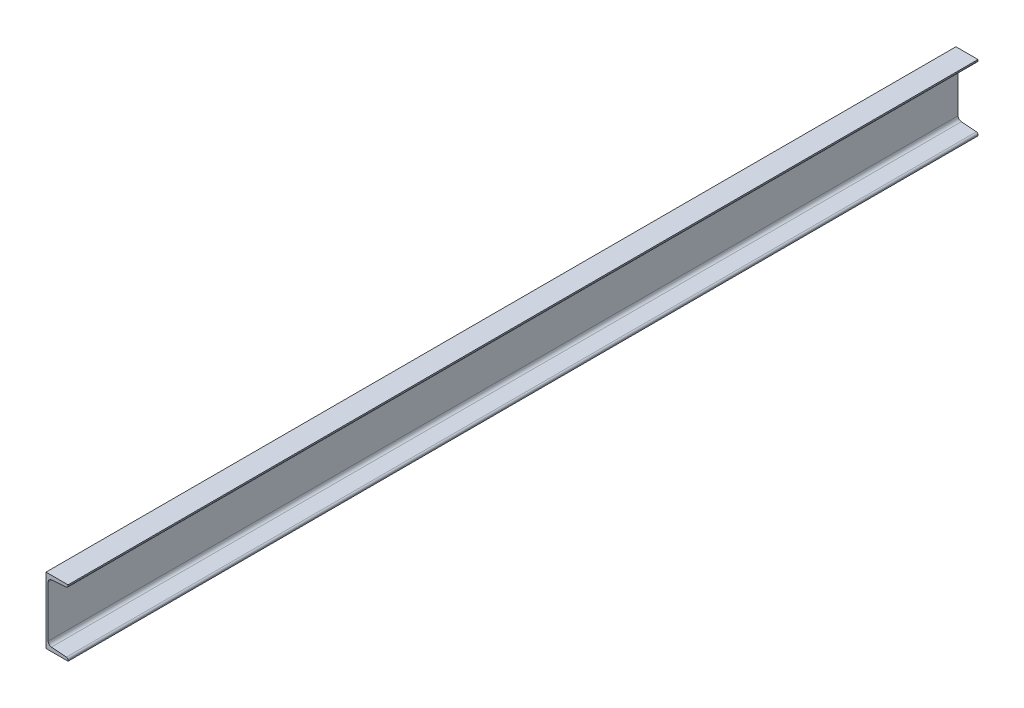
ISO-10303-21;
HEADER;
FILE_DESCRIPTION(('STEP AP214'),'2;1');
FILE_NAME('part.step','',(''),(''),'','','');
FILE_SCHEMA(('AUTOMOTIVE_DESIGN { 1 0 10303 214 1 1 1 1 }'));
ENDSEC;
DATA;
#1=APPLICATION_CONTEXT('core data for automotive mechanical design processes');
#2=APPLICATION_PROTOCOL_DEFINITION('international standard','automotive_design',2000,#1);
#3=PRODUCT_CONTEXT('',#1,'mechanical');
#4=PRODUCT('Part','Part','',(#3));
#5=PRODUCT_RELATED_PRODUCT_CATEGORY('part','',(#4));
#6=PRODUCT_DEFINITION_FORMATION('','',#4);
#7=PRODUCT_DEFINITION_CONTEXT('part definition',#1,'design');
#8=PRODUCT_DEFINITION('design','',#6,#7);
#9=PRODUCT_DEFINITION_SHAPE('','',#8);
#10=(LENGTH_UNIT() NAMED_UNIT(*) SI_UNIT(.MILLI.,.METRE.));
#11=(NAMED_UNIT(*) PLANE_ANGLE_UNIT() SI_UNIT($,.RADIAN.));
#12=(NAMED_UNIT(*) SI_UNIT($,.STERADIAN.) SOLID_ANGLE_UNIT());
#13=UNCERTAINTY_MEASURE_WITH_UNIT(LENGTH_MEASURE(1.E-05),#10,'distance_accuracy_value','');
#14=(GEOMETRIC_REPRESENTATION_CONTEXT(3) GLOBAL_UNCERTAINTY_ASSIGNED_CONTEXT((#13)) GLOBAL_UNIT_ASSIGNED_CONTEXT((#10,
#11,#12)) REPRESENTATION_CONTEXT('',''));
#15=CARTESIAN_POINT('',(0.,0.,0.));
#16=DIRECTION('',(0.,0.,1.));
#17=DIRECTION('',(1.,0.,0.));
#18=AXIS2_PLACEMENT_3D('',#15,#16,#17);
#19=CARTESIAN_POINT('',(5066.58544457096,2971.47976473154,4125.));
#20=DIRECTION('',(0.,1.,0.));
#21=DIRECTION('',(0.,0.,1.));
#22=AXIS2_PLACEMENT_3D('',#19,#20,#21);
#23=PLANE('',#22);
#24=DIRECTION('',(1.,0.,0.));
#25=VECTOR('',#24,1.);
#26=CARTESIAN_POINT('',(5066.58544457096,2971.47976473154,0.));
#27=LINE('',#26,#25);
#28=CARTESIAN_POINT('',(4966.58544457096,2971.47976473154,0.));
#29=VERTEX_POINT('',#28);
#30=CARTESIAN_POINT('',(5066.58544457096,2971.47976473154,0.));
#31=VERTEX_POINT('',#30);
#32=EDGE_CURVE('E164',#29,#31,#27,.T.);
#33=ORIENTED_EDGE('',*,*,#32,.T.);
#34=DIRECTION('',(0.,0.,-1.));
#35=VECTOR('',#34,1.);
#36=CARTESIAN_POINT('',(5066.58544457096,2971.47976473154,4125.));
#37=LINE('',#36,#35);
#38=CARTESIAN_POINT('',(5066.58544457096,2971.47976473154,4125.));
#39=VERTEX_POINT('',#38);
#40=EDGE_CURVE('E11',#39,#31,#37,.T.);
#41=ORIENTED_EDGE('',*,*,#40,.F.);
#42=DIRECTION('',(1.,0.,0.));
#43=VECTOR('',#42,1.);
#44=CARTESIAN_POINT('',(5066.58544457096,2971.47976473154,4125.));
#45=LINE('',#44,#43);
#46=CARTESIAN_POINT('',(4966.58544457096,2971.47976473154,4125.));
#47=VERTEX_POINT('',#46);
#48=EDGE_CURVE('E198',#47,#39,#45,.T.);
#49=ORIENTED_EDGE('',*,*,#48,.F.);
#50=DIRECTION('',(0.,0.,-1.));
#51=VECTOR('',#50,1.);
#52=CARTESIAN_POINT('',(4966.58544457096,2971.47976473154,4125.));
#53=LINE('',#52,#51);
#54=EDGE_CURVE('E160',#47,#29,#53,.T.);
#55=ORIENTED_EDGE('',*,*,#54,.T.);
#56=EDGE_LOOP('',(#33,#41,#49,#55));
#57=FACE_BOUND('',#56,.T.);
#58=ADVANCED_FACE('F39',(#57),#23,.F.);
#59=CARTESIAN_POINT('',(5066.58544457096,2971.47976473154,4125.));
#60=DIRECTION('',(-1.,0.,0.));
#61=DIRECTION('',(0.,0.,1.));
#62=AXIS2_PLACEMENT_3D('',#59,#60,#61);
#63=PLANE('',#62);
#64=DIRECTION('',(0.,1.,0.));
#65=VECTOR('',#64,1.);
#66=CARTESIAN_POINT('',(5066.58544457096,2971.47976473154,0.));
#67=LINE('',#66,#65);
#68=CARTESIAN_POINT('',(5066.58544457096,2976.04549735289,0.));
#69=VERTEX_POINT('',#68);
#70=EDGE_CURVE('E168',#31,#69,#67,.T.);
#71=ORIENTED_EDGE('',*,*,#70,.T.);
#72=DIRECTION('',(0.,0.,-1.));
#73=VECTOR('',#72,1.);
#74=CARTESIAN_POINT('',(5066.58544457096,2976.04549735289,4125.));
#75=LINE('',#74,#73);
#76=CARTESIAN_POINT('',(5066.58544457096,2976.04549735289,4125.));
#77=VERTEX_POINT('',#76);
#78=EDGE_CURVE('E48',#77,#69,#75,.T.);
#79=ORIENTED_EDGE('',*,*,#78,.F.);
#80=DIRECTION('',(0.,1.,0.));
#81=VECTOR('',#80,1.);
#82=CARTESIAN_POINT('',(5066.58544457096,2971.47976473154,4125.));
#83=LINE('',#82,#81);
#84=EDGE_CURVE('E111',#39,#77,#83,.T.);
#85=ORIENTED_EDGE('',*,*,#84,.F.);
#86=ORIENTED_EDGE('',*,*,#40,.T.);
#87=EDGE_LOOP('',(#71,#79,#85,#86));
#88=FACE_BOUND('',#87,.T.);
#89=ADVANCED_FACE('F292',(#88),#63,.F.);
#90=CARTESIAN_POINT('',(5058.58544457096,2976.04549735289,4125.));
#91=DIRECTION('',(0.,0.,-1.));
#92=DIRECTION('',(-1.,0.,0.));
#93=AXIS2_PLACEMENT_3D('',#90,#91,#92);
#94=CYLINDRICAL_SURFACE('',#93,7.99999999999969);
#95=CARTESIAN_POINT('',(5058.58544457096,2976.04549735289,0.));
#96=DIRECTION('',(0.,0.,1.));
#97=DIRECTION('',(1.,0.,0.));
#98=AXIS2_PLACEMENT_3D('',#95,#96,#97);
#99=CIRCLE('',#98,7.99999999999969);
#100=CARTESIAN_POINT('',(5059.23245605057,2984.01929043681,0.));
#101=VERTEX_POINT('',#100);
#102=EDGE_CURVE('E171',#69,#101,#99,.T.);
#103=ORIENTED_EDGE('',*,*,#102,.T.);
#104=DIRECTION('',(0.,0.,-1.));
#105=VECTOR('',#104,1.);
#106=CARTESIAN_POINT('',(5059.23245605057,2984.01929043681,4125.));
#107=LINE('',#106,#105);
#108=CARTESIAN_POINT('',(5059.23245605057,2984.01929043681,4125.));
#109=VERTEX_POINT('',#108);
#110=EDGE_CURVE('E225',#109,#101,#107,.T.);
#111=ORIENTED_EDGE('',*,*,#110,.F.);
#112=CARTESIAN_POINT('',(5058.58544457096,2976.04549735289,4125.));
#113=DIRECTION('',(0.,0.,1.));
#114=DIRECTION('',(1.,0.,0.));
#115=AXIS2_PLACEMENT_3D('',#112,#113,#114);
#116=CIRCLE('',#115,7.99999999999969);
#117=EDGE_CURVE('E235',#77,#109,#116,.T.);
#118=ORIENTED_EDGE('',*,*,#117,.F.);
#119=ORIENTED_EDGE('',*,*,#78,.T.);
#120=EDGE_LOOP('',(#103,#111,#118,#119));
#121=FACE_BOUND('',#120,.T.);
#122=ADVANCED_FACE('F233',(#121),#94,.T.);
#123=CARTESIAN_POINT('',(4991.29142161174,2989.53217856369,4125.));
#124=DIRECTION('',(-0.0808764349513209,-0.996724135490641,0.));
#125=DIRECTION('',(0.996724135490641,-0.0808764349513209,0.));
#126=AXIS2_PLACEMENT_3D('',#123,#124,#125);
#127=PLANE('',#126);
#128=DIRECTION('',(-0.996724135490641,0.0808764349513209,0.));
#129=VECTOR('',#128,1.);
#130=CARTESIAN_POINT('',(4991.29142161174,2989.53217856369,0.));
#131=LINE('',#130,#129);
#132=CARTESIAN_POINT('',(4991.29142161174,2989.53217856369,0.));
#133=VERTEX_POINT('',#132);
#134=EDGE_CURVE('E174',#101,#133,#131,.T.);
#135=ORIENTED_EDGE('',*,*,#134,.T.);
#136=DIRECTION('',(0.,0.,-1.));
#137=VECTOR('',#136,1.);
#138=CARTESIAN_POINT('',(4991.29142161174,2989.53217856369,4125.));
#139=LINE('',#138,#137);
#140=CARTESIAN_POINT('',(4991.29142161174,2989.53217856369,4125.));
#141=VERTEX_POINT('',#140);
#142=EDGE_CURVE('E221',#141,#133,#139,.T.);
#143=ORIENTED_EDGE('',*,*,#142,.F.);
#144=DIRECTION('',(-0.996724135490641,0.0808764349513209,0.));
#145=VECTOR('',#144,1.);
#146=CARTESIAN_POINT('',(4991.29142161174,2989.53217856369,4125.));
#147=LINE('',#146,#145);
#148=EDGE_CURVE('E254',#109,#141,#147,.T.);
#149=ORIENTED_EDGE('',*,*,#148,.F.);
#150=ORIENTED_EDGE('',*,*,#110,.T.);
#151=EDGE_LOOP('',(#135,#143,#149,#150));
#152=FACE_BOUND('',#151,.T.);
#153=ADVANCED_FACE('F244',(#152),#127,.F.);
#154=CARTESIAN_POINT('',(4992.58544457096,3005.47976473154,4125.));
#155=DIRECTION('',(0.,0.,-1.));
#156=DIRECTION('',(-1.,0.,0.));
#157=AXIS2_PLACEMENT_3D('',#154,#155,#156);
#158=CYLINDRICAL_SURFACE('',#157,15.9999999999996);
#159=CARTESIAN_POINT('',(4992.58544457096,3005.47976473154,0.));
#160=DIRECTION('',(0.,0.,-1.));
#161=DIRECTION('',(-1.,0.,0.));
#162=AXIS2_PLACEMENT_3D('',#159,#160,#161);
#163=CIRCLE('',#162,15.9999999999996);
#164=CARTESIAN_POINT('',(4976.58544457096,3005.47976473154,0.));
#165=VERTEX_POINT('',#164);
#166=EDGE_CURVE('E177',#133,#165,#163,.T.);
#167=ORIENTED_EDGE('',*,*,#166,.T.);
#168=DIRECTION('',(0.,0.,-1.));
#169=VECTOR('',#168,1.);
#170=CARTESIAN_POINT('',(4976.58544457096,3005.47976473154,4125.));
#171=LINE('',#170,#169);
#172=CARTESIAN_POINT('',(4976.58544457096,3005.47976473154,4125.));
#173=VERTEX_POINT('',#172);
#174=EDGE_CURVE('E217',#173,#165,#171,.T.);
#175=ORIENTED_EDGE('',*,*,#174,.F.);
#176=CARTESIAN_POINT('',(4992.58544457096,3005.47976473154,4125.));
#177=DIRECTION('',(0.,0.,-1.));
#178=DIRECTION('',(-1.,0.,0.));
#179=AXIS2_PLACEMENT_3D('',#176,#177,#178);
#180=CIRCLE('',#179,15.9999999999996);
#181=EDGE_CURVE('E250',#141,#173,#180,.T.);
#182=ORIENTED_EDGE('',*,*,#181,.F.);
#183=ORIENTED_EDGE('',*,*,#142,.T.);
#184=EDGE_LOOP('',(#167,#175,#182,#183));
#185=FACE_BOUND('',#184,.T.);
#186=ADVANCED_FACE('F248',(#185),#158,.F.);
#187=CARTESIAN_POINT('',(4976.58544457096,3237.47976473154,4125.));
#188=DIRECTION('',(-1.,0.,0.));
#189=DIRECTION('',(0.,0.,1.));
#190=AXIS2_PLACEMENT_3D('',#187,#188,#189);
#191=PLANE('',#190);
#192=DIRECTION('',(0.,1.,0.));
#193=VECTOR('',#192,1.);
#194=CARTESIAN_POINT('',(4976.58544457096,3237.47976473154,0.));
#195=LINE('',#194,#193);
#196=CARTESIAN_POINT('',(4976.58544457096,3237.47976473154,0.));
#197=VERTEX_POINT('',#196);
#198=EDGE_CURVE('E180',#165,#197,#195,.T.);
#199=ORIENTED_EDGE('',*,*,#198,.T.);
#200=DIRECTION('',(0.,0.,-1.));
#201=VECTOR('',#200,1.);
#202=CARTESIAN_POINT('',(4976.58544457096,3237.47976473154,4125.));
#203=LINE('',#202,#201);
#204=CARTESIAN_POINT('',(4976.58544457096,3237.47976473154,4125.));
#205=VERTEX_POINT('',#204);
#206=EDGE_CURVE('E213',#205,#197,#203,.T.);
#207=ORIENTED_EDGE('',*,*,#206,.F.);
#208=DIRECTION('',(0.,1.,0.));
#209=VECTOR('',#208,1.);
#210=CARTESIAN_POINT('',(4976.58544457096,3237.47976473154,4125.));
#211=LINE('',#210,#209);
#212=EDGE_CURVE('E253',#173,#205,#211,.T.);
#213=ORIENTED_EDGE('',*,*,#212,.F.);
#214=ORIENTED_EDGE('',*,*,#174,.T.);
#215=EDGE_LOOP('',(#199,#207,#213,#214));
#216=FACE_BOUND('',#215,.T.);
#217=ADVANCED_FACE('F305',(#216),#191,.F.);
#218=CARTESIAN_POINT('',(4992.58544457096,3237.47976473154,4125.));
#219=DIRECTION('',(0.,0.,-1.));
#220=DIRECTION('',(-1.,0.,0.));
#221=AXIS2_PLACEMENT_3D('',#218,#219,#220);
#222=CYLINDRICAL_SURFACE('',#221,15.9999999999996);
#223=CARTESIAN_POINT('',(4992.58544457096,3237.47976473154,0.));
#224=DIRECTION('',(0.,0.,-1.));
#225=DIRECTION('',(1.,0.,0.));
#226=AXIS2_PLACEMENT_3D('',#223,#224,#225);
#227=CIRCLE('',#226,15.9999999999996);
#228=CARTESIAN_POINT('',(4991.29142161174,3253.42735089939,0.));
#229=VERTEX_POINT('',#228);
#230=EDGE_CURVE('E183',#197,#229,#227,.T.);
#231=ORIENTED_EDGE('',*,*,#230,.T.);
#232=DIRECTION('',(0.,0.,-1.));
#233=VECTOR('',#232,1.);
#234=CARTESIAN_POINT('',(4991.29142161174,3253.42735089939,4125.));
#235=LINE('',#234,#233);
#236=CARTESIAN_POINT('',(4991.29142161174,3253.42735089939,4125.));
#237=VERTEX_POINT('',#236);
#238=EDGE_CURVE('E209',#237,#229,#235,.T.);
#239=ORIENTED_EDGE('',*,*,#238,.F.);
#240=CARTESIAN_POINT('',(4992.58544457096,3237.47976473154,4125.));
#241=DIRECTION('',(0.,0.,-1.));
#242=DIRECTION('',(1.,0.,0.));
#243=AXIS2_PLACEMENT_3D('',#240,#241,#242);
#244=CIRCLE('',#243,15.9999999999996);
#245=EDGE_CURVE('E258',#205,#237,#244,.T.);
#246=ORIENTED_EDGE('',*,*,#245,.F.);
#247=ORIENTED_EDGE('',*,*,#206,.T.);
#248=EDGE_LOOP('',(#231,#239,#246,#247));
#249=FACE_BOUND('',#248,.T.);
#250=ADVANCED_FACE('F308',(#249),#222,.F.);
#251=CARTESIAN_POINT('',(4991.29142161174,3253.42735089939,4125.));
#252=DIRECTION('',(-0.0808764349513209,0.996724135490641,0.));
#253=DIRECTION('',(-0.996724135490641,-0.0808764349513209,0.));
#254=AXIS2_PLACEMENT_3D('',#251,#252,#253);
#255=PLANE('',#254);
#256=DIRECTION('',(0.996724135490641,0.0808764349513209,0.));
#257=VECTOR('',#256,1.);
#258=CARTESIAN_POINT('',(4991.29142161174,3253.42735089939,0.));
#259=LINE('',#258,#257);
#260=CARTESIAN_POINT('',(5059.23245605057,3258.94023902627,0.));
#261=VERTEX_POINT('',#260);
#262=EDGE_CURVE('E186',#229,#261,#259,.T.);
#263=ORIENTED_EDGE('',*,*,#262,.T.);
#264=DIRECTION('',(0.,0.,-1.));
#265=VECTOR('',#264,1.);
#266=CARTESIAN_POINT('',(5059.23245605057,3258.94023902627,4125.));
#267=LINE('',#266,#265);
#268=CARTESIAN_POINT('',(5059.23245605057,3258.94023902627,4125.));
#269=VERTEX_POINT('',#268);
#270=EDGE_CURVE('E205',#269,#261,#267,.T.);
#271=ORIENTED_EDGE('',*,*,#270,.F.);
#272=DIRECTION('',(0.996724135490641,0.0808764349513209,0.));
#273=VECTOR('',#272,1.);
#274=CARTESIAN_POINT('',(4991.29142161174,3253.42735089939,4125.));
#275=LINE('',#274,#273);
#276=EDGE_CURVE('E265',#237,#269,#275,.T.);
#277=ORIENTED_EDGE('',*,*,#276,.F.);
#278=ORIENTED_EDGE('',*,*,#238,.T.);
#279=EDGE_LOOP('',(#263,#271,#277,#278));
#280=FACE_BOUND('',#279,.T.);
#281=ADVANCED_FACE('F273',(#280),#255,.F.);
#282=CARTESIAN_POINT('',(5058.58544457096,3266.91403211019,4125.));
#283=DIRECTION('',(0.,0.,-1.));
#284=DIRECTION('',(-1.,0.,0.));
#285=AXIS2_PLACEMENT_3D('',#282,#283,#284);
#286=CYLINDRICAL_SURFACE('',#285,7.99999999999969);
#287=CARTESIAN_POINT('',(5058.58544457096,3266.91403211019,0.));
#288=DIRECTION('',(0.,0.,1.));
#289=DIRECTION('',(-1.,0.,0.));
#290=AXIS2_PLACEMENT_3D('',#287,#288,#289);
#291=CIRCLE('',#290,7.99999999999969);
#292=CARTESIAN_POINT('',(5066.58544457096,3266.91403211019,0.));
#293=VERTEX_POINT('',#292);
#294=EDGE_CURVE('E189',#261,#293,#291,.T.);
#295=ORIENTED_EDGE('',*,*,#294,.T.);
#296=DIRECTION('',(0.,0.,-1.));
#297=VECTOR('',#296,1.);
#298=CARTESIAN_POINT('',(5066.58544457096,3266.91403211019,4125.));
#299=LINE('',#298,#297);
#300=CARTESIAN_POINT('',(5066.58544457096,3266.91403211019,4125.));
#301=VERTEX_POINT('',#300);
#302=EDGE_CURVE('E153',#301,#293,#299,.T.);
#303=ORIENTED_EDGE('',*,*,#302,.F.);
#304=CARTESIAN_POINT('',(5058.58544457096,3266.91403211019,4125.));
#305=DIRECTION('',(0.,0.,1.));
#306=DIRECTION('',(-1.,0.,0.));
#307=AXIS2_PLACEMENT_3D('',#304,#305,#306);
#308=CIRCLE('',#307,7.99999999999969);
#309=EDGE_CURVE('E142',#269,#301,#308,.T.);
#310=ORIENTED_EDGE('',*,*,#309,.F.);
#311=ORIENTED_EDGE('',*,*,#270,.T.);
#312=EDGE_LOOP('',(#295,#303,#310,#311));
#313=FACE_BOUND('',#312,.T.);
#314=ADVANCED_FACE('F277',(#313),#286,.T.);
#315=CARTESIAN_POINT('',(5066.58544457096,3271.47976473154,4125.));
#316=DIRECTION('',(-1.,0.,0.));
#317=DIRECTION('',(0.,0.,1.));
#318=AXIS2_PLACEMENT_3D('',#315,#316,#317);
#319=PLANE('',#318);
#320=DIRECTION('',(0.,1.,0.));
#321=VECTOR('',#320,1.);
#322=CARTESIAN_POINT('',(5066.58544457096,3271.47976473154,0.));
#323=LINE('',#322,#321);
#324=CARTESIAN_POINT('',(5066.58544457096,3271.47976473154,0.));
#325=VERTEX_POINT('',#324);
#326=EDGE_CURVE('E151',#293,#325,#323,.T.);
#327=ORIENTED_EDGE('',*,*,#326,.T.);
#328=DIRECTION('',(0.,0.,-1.));
#329=VECTOR('',#328,1.);
#330=CARTESIAN_POINT('',(5066.58544457096,3271.47976473154,4125.));
#331=LINE('',#330,#329);
#332=CARTESIAN_POINT('',(5066.58544457096,3271.47976473154,4125.));
#333=VERTEX_POINT('',#332);
#334=EDGE_CURVE('E148',#333,#325,#331,.T.);
#335=ORIENTED_EDGE('',*,*,#334,.F.);
#336=DIRECTION('',(0.,1.,0.));
#337=VECTOR('',#336,1.);
#338=CARTESIAN_POINT('',(5066.58544457096,3271.47976473154,4125.));
#339=LINE('',#338,#337);
#340=EDGE_CURVE('E136',#301,#333,#339,.T.);
#341=ORIENTED_EDGE('',*,*,#340,.F.);
#342=ORIENTED_EDGE('',*,*,#302,.T.);
#343=EDGE_LOOP('',(#327,#335,#341,#342));
#344=FACE_BOUND('',#343,.T.);
#345=ADVANCED_FACE('F149',(#344),#319,.F.);
#346=CARTESIAN_POINT('',(5066.58544457096,3271.47976473154,4125.));
#347=DIRECTION('',(0.,-1.,0.));
#348=DIRECTION('',(0.,0.,-1.));
#349=AXIS2_PLACEMENT_3D('',#346,#347,#348);
#350=PLANE('',#349);
#351=DIRECTION('',(-1.,0.,0.));
#352=VECTOR('',#351,1.);
#353=CARTESIAN_POINT('',(5066.58544457096,3271.47976473154,0.));
#354=LINE('',#353,#352);
#355=CARTESIAN_POINT('',(4966.58544457096,3271.47976473154,0.));
#356=VERTEX_POINT('',#355);
#357=EDGE_CURVE('E97',#325,#356,#354,.T.);
#358=ORIENTED_EDGE('',*,*,#357,.T.);
#359=DIRECTION('',(0.,0.,-1.));
#360=VECTOR('',#359,1.);
#361=CARTESIAN_POINT('',(4966.58544457096,3271.47976473154,4125.));
#362=LINE('',#361,#360);
#363=CARTESIAN_POINT('',(4966.58544457096,3271.47976473154,4125.));
#364=VERTEX_POINT('',#363);
#365=EDGE_CURVE('E154',#364,#356,#362,.T.);
#366=ORIENTED_EDGE('',*,*,#365,.F.);
#367=DIRECTION('',(-1.,0.,0.));
#368=VECTOR('',#367,1.);
#369=CARTESIAN_POINT('',(5066.58544457096,3271.47976473154,4125.));
#370=LINE('',#369,#368);
#371=EDGE_CURVE('E140',#333,#364,#370,.T.);
#372=ORIENTED_EDGE('',*,*,#371,.F.);
#373=ORIENTED_EDGE('',*,*,#334,.T.);
#374=EDGE_LOOP('',(#358,#366,#372,#373));
#375=FACE_BOUND('',#374,.T.);
#376=ADVANCED_FACE('F156',(#375),#350,.F.);
#377=CARTESIAN_POINT('',(4966.58544457096,3271.47976473154,4125.));
#378=DIRECTION('',(1.,0.,0.));
#379=DIRECTION('',(0.,0.,-1.));
#380=AXIS2_PLACEMENT_3D('',#377,#378,#379);
#381=PLANE('',#380);
#382=DIRECTION('',(0.,-1.,0.));
#383=VECTOR('',#382,1.);
#384=CARTESIAN_POINT('',(4966.58544457096,3271.47976473154,0.));
#385=LINE('',#384,#383);
#386=EDGE_CURVE('E103',#356,#29,#385,.T.);
#387=ORIENTED_EDGE('',*,*,#386,.T.);
#388=ORIENTED_EDGE('',*,*,#54,.F.);
#389=DIRECTION('',(0.,-1.,0.));
#390=VECTOR('',#389,1.);
#391=CARTESIAN_POINT('',(4966.58544457096,3271.47976473154,4125.));
#392=LINE('',#391,#390);
#393=EDGE_CURVE('E56',#364,#47,#392,.T.);
#394=ORIENTED_EDGE('',*,*,#393,.F.);
#395=ORIENTED_EDGE('',*,*,#365,.T.);
#396=EDGE_LOOP('',(#387,#388,#394,#395));
#397=FACE_BOUND('',#396,.T.);
#398=ADVANCED_FACE('F281',(#397),#381,.F.);
#399=CARTESIAN_POINT('',(5058.58544457096,3266.91403211019,4125.));
#400=DIRECTION('',(0.,0.,-1.));
#401=DIRECTION('',(-1.,0.,0.));
#402=AXIS2_PLACEMENT_3D('',#399,#400,#401);
#403=PLANE('',#402);
#404=ORIENTED_EDGE('',*,*,#48,.T.);
#405=ORIENTED_EDGE('',*,*,#84,.T.);
#406=ORIENTED_EDGE('',*,*,#117,.T.);
#407=ORIENTED_EDGE('',*,*,#148,.T.);
#408=ORIENTED_EDGE('',*,*,#181,.T.);
#409=ORIENTED_EDGE('',*,*,#212,.T.);
#410=ORIENTED_EDGE('',*,*,#245,.T.);
#411=ORIENTED_EDGE('',*,*,#276,.T.);
#412=ORIENTED_EDGE('',*,*,#309,.T.);
#413=ORIENTED_EDGE('',*,*,#340,.T.);
#414=ORIENTED_EDGE('',*,*,#371,.T.);
#415=ORIENTED_EDGE('',*,*,#393,.T.);
#416=EDGE_LOOP('',(#404,#405,#406,#407,#408,#409,#410,#411,#412,#413,#414,#415));
#417=FACE_BOUND('',#416,.T.);
#418=ADVANCED_FACE('F138',(#417),#403,.F.);
#419=CARTESIAN_POINT('',(5058.58544457096,3266.91403211019,0.));
#420=DIRECTION('',(0.,0.,-1.));
#421=DIRECTION('',(-1.,0.,0.));
#422=AXIS2_PLACEMENT_3D('',#419,#420,#421);
#423=PLANE('',#422);
#424=ORIENTED_EDGE('',*,*,#32,.F.);
#425=ORIENTED_EDGE('',*,*,#386,.F.);
#426=ORIENTED_EDGE('',*,*,#357,.F.);
#427=ORIENTED_EDGE('',*,*,#326,.F.);
#428=ORIENTED_EDGE('',*,*,#294,.F.);
#429=ORIENTED_EDGE('',*,*,#262,.F.);
#430=ORIENTED_EDGE('',*,*,#230,.F.);
#431=ORIENTED_EDGE('',*,*,#198,.F.);
#432=ORIENTED_EDGE('',*,*,#166,.F.);
#433=ORIENTED_EDGE('',*,*,#134,.F.);
#434=ORIENTED_EDGE('',*,*,#102,.F.);
#435=ORIENTED_EDGE('',*,*,#70,.F.);
#436=EDGE_LOOP('',(#424,#425,#426,#427,#428,#429,#430,#431,#432,#433,#434,#435));
#437=FACE_BOUND('',#436,.T.);
#438=ADVANCED_FACE('F239',(#437),#423,.T.);
#439=CLOSED_SHELL('',(#58,#89,#122,#153,#186,#217,#250,#281,#314,#345,#376,#398,#418,#438));
#440=MANIFOLD_SOLID_BREP('B2',#439);
#441=ADVANCED_BREP_SHAPE_REPRESENTATION('',(#18,#440),#14);
#442=SHAPE_DEFINITION_REPRESENTATION(#9,#441);
ENDSEC;
END-ISO-10303-21;
